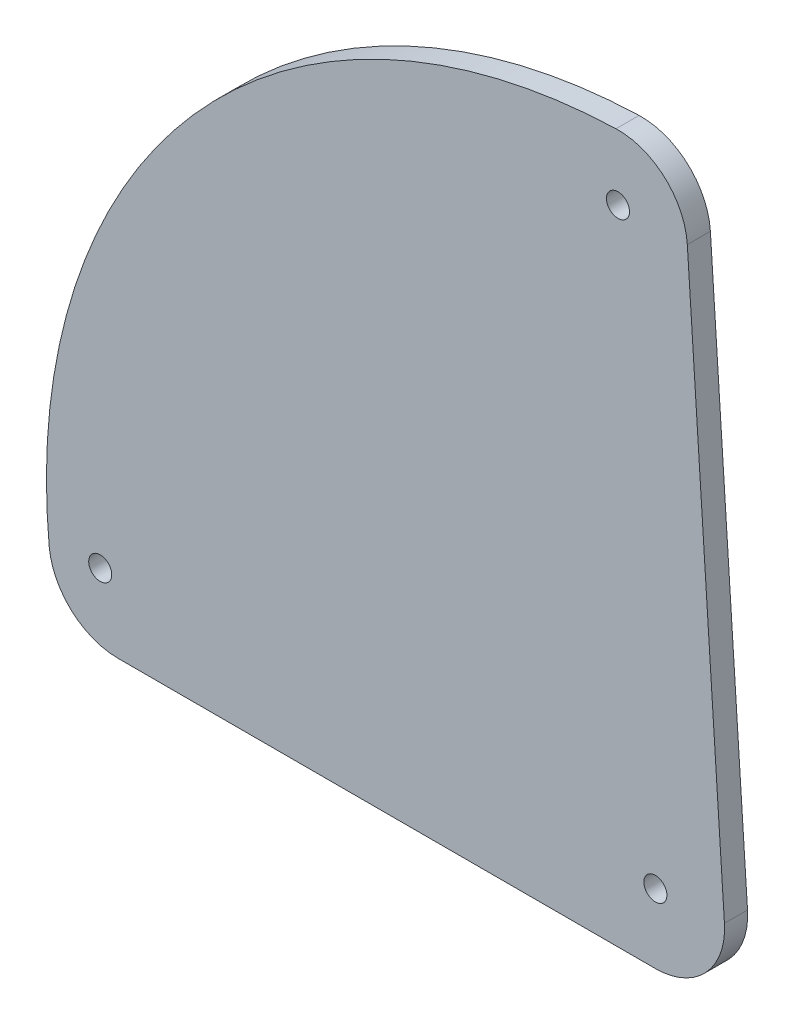
ISO-10303-21;
HEADER;
FILE_DESCRIPTION(('STEP AP214'),'2;1');
FILE_NAME('part.step','',(''),(''),'','','');
FILE_SCHEMA(('AUTOMOTIVE_DESIGN { 1 0 10303 214 1 1 1 1 }'));
ENDSEC;
DATA;
#1=APPLICATION_CONTEXT('core data for automotive mechanical design processes');
#2=APPLICATION_PROTOCOL_DEFINITION('international standard','automotive_design',2000,#1);
#3=PRODUCT_CONTEXT('',#1,'mechanical');
#4=PRODUCT('Part','Part','',(#3));
#5=PRODUCT_RELATED_PRODUCT_CATEGORY('part','',(#4));
#6=PRODUCT_DEFINITION_FORMATION('','',#4);
#7=PRODUCT_DEFINITION_CONTEXT('part definition',#1,'design');
#8=PRODUCT_DEFINITION('design','',#6,#7);
#9=PRODUCT_DEFINITION_SHAPE('','',#8);
#10=(LENGTH_UNIT() NAMED_UNIT(*) SI_UNIT(.MILLI.,.METRE.));
#11=(NAMED_UNIT(*) PLANE_ANGLE_UNIT() SI_UNIT($,.RADIAN.));
#12=(NAMED_UNIT(*) SI_UNIT($,.STERADIAN.) SOLID_ANGLE_UNIT());
#13=UNCERTAINTY_MEASURE_WITH_UNIT(LENGTH_MEASURE(1.E-05),#10,'distance_accuracy_value','');
#14=(GEOMETRIC_REPRESENTATION_CONTEXT(3) GLOBAL_UNCERTAINTY_ASSIGNED_CONTEXT((#13)) GLOBAL_UNIT_ASSIGNED_CONTEXT((#10,
#11,#12)) REPRESENTATION_CONTEXT('',''));
#15=CARTESIAN_POINT('',(0.,0.,0.));
#16=DIRECTION('',(0.,0.,1.));
#17=DIRECTION('',(1.,0.,0.));
#18=AXIS2_PLACEMENT_3D('',#15,#16,#17);
#19=CARTESIAN_POINT('',(112.254705657256,68.7333805444998,-23.206005243));
#20=DIRECTION('',(0.,0.,1.));
#21=DIRECTION('',(1.,0.,0.));
#22=AXIS2_PLACEMENT_3D('',#19,#20,#21);
#23=CYLINDRICAL_SURFACE('',#22,14.9999999888805);
#24=CARTESIAN_POINT('',(112.254705657256,68.7333805444998,-18.206005243));
#25=DIRECTION('',(0.,0.,1.));
#26=DIRECTION('',(1.,0.,0.));
#27=AXIS2_PLACEMENT_3D('',#24,#25,#26);
#28=CIRCLE('',#27,14.9999999888805);
#29=CARTESIAN_POINT('',(127.222902207337,69.7096447016691,-18.206005243));
#30=VERTEX_POINT('',#29);
#31=CARTESIAN_POINT('',(111.771655863061,83.7256006123464,-18.206005243));
#32=VERTEX_POINT('',#31);
#33=EDGE_CURVE('E130',#30,#32,#28,.T.);
#34=ORIENTED_EDGE('',*,*,#33,.F.);
#35=DIRECTION('',(0.,0.,1.));
#36=VECTOR('',#35,1.);
#37=CARTESIAN_POINT('',(127.222902207337,69.7096447016691,-23.206005243));
#38=LINE('',#37,#36);
#39=CARTESIAN_POINT('',(127.222902207337,69.7096447016691,-23.206005243));
#40=VERTEX_POINT('',#39);
#41=EDGE_CURVE('E11',#40,#30,#38,.T.);
#42=ORIENTED_EDGE('',*,*,#41,.F.);
#43=CARTESIAN_POINT('',(112.254705657256,68.7333805444998,-23.206005243));
#44=DIRECTION('',(0.,0.,1.));
#45=DIRECTION('',(1.,0.,0.));
#46=AXIS2_PLACEMENT_3D('',#43,#44,#45);
#47=CIRCLE('',#46,14.9999999888805);
#48=CARTESIAN_POINT('',(111.771655863061,83.7256006123464,-23.206005243));
#49=VERTEX_POINT('',#48);
#50=EDGE_CURVE('E151',#40,#49,#47,.T.);
#51=ORIENTED_EDGE('',*,*,#50,.T.);
#52=DIRECTION('',(0.,0.,1.));
#53=VECTOR('',#52,1.);
#54=CARTESIAN_POINT('',(111.771655863061,83.7256006123464,-23.206005243));
#55=LINE('',#54,#53);
#56=EDGE_CURVE('E42',#49,#32,#55,.T.);
#57=ORIENTED_EDGE('',*,*,#56,.T.);
#58=EDGE_LOOP('',(#34,#42,#51,#57));
#59=FACE_BOUND('',#58,.T.);
#60=ADVANCED_FACE('F39',(#59),#23,.T.);
#61=CARTESIAN_POINT('',(135.268196543963,-53.6417515874666,-23.206005243));
#62=DIRECTION('',(0.997879770745094,0.065084277192868,0.));
#63=DIRECTION('',(-0.065084277192868,0.997879770745094,0.));
#64=AXIS2_PLACEMENT_3D('',#61,#62,#63);
#65=PLANE('',#64);
#66=DIRECTION('',(-0.065084277192868,0.997879770745094,0.));
#67=VECTOR('',#66,1.);
#68=CARTESIAN_POINT('',(135.268196543963,-53.6417515874666,-18.206005243));
#69=LINE('',#68,#67);
#70=CARTESIAN_POINT('',(135.268196543963,-53.6417515874666,-18.206005243));
#71=VERTEX_POINT('',#70);
#72=EDGE_CURVE('E148',#71,#30,#69,.T.);
#73=ORIENTED_EDGE('',*,*,#72,.F.);
#74=DIRECTION('',(0.,0.,1.));
#75=VECTOR('',#74,1.);
#76=CARTESIAN_POINT('',(135.268196543963,-53.6417515874666,-23.206005243));
#77=LINE('',#76,#75);
#78=CARTESIAN_POINT('',(135.268196543963,-53.6417515874666,-23.206005243));
#79=VERTEX_POINT('',#78);
#80=EDGE_CURVE('E49',#79,#71,#77,.T.);
#81=ORIENTED_EDGE('',*,*,#80,.F.);
#82=DIRECTION('',(-0.065084277192868,0.997879770745094,0.));
#83=VECTOR('',#82,1.);
#84=CARTESIAN_POINT('',(135.268196543963,-53.6417515874666,-23.206005243));
#85=LINE('',#84,#83);
#86=EDGE_CURVE('E116',#79,#40,#85,.T.);
#87=ORIENTED_EDGE('',*,*,#86,.T.);
#88=ORIENTED_EDGE('',*,*,#41,.T.);
#89=EDGE_LOOP('',(#73,#81,#87,#88));
#90=FACE_BOUND('',#89,.T.);
#91=ADVANCED_FACE('F163',(#90),#65,.T.);
#92=CARTESIAN_POINT('',(120.299999998114,-54.61801574436,-23.206005243));
#93=DIRECTION('',(0.,0.,1.));
#94=DIRECTION('',(1.,0.,0.));
#95=AXIS2_PLACEMENT_3D('',#92,#93,#94);
#96=CYLINDRICAL_SURFACE('',#95,14.99999998464);
#97=CARTESIAN_POINT('',(120.299999998114,-54.61801574436,-18.206005243));
#98=DIRECTION('',(0.,0.,1.));
#99=DIRECTION('',(1.,0.,0.));
#100=AXIS2_PLACEMENT_3D('',#97,#98,#99);
#101=CIRCLE('',#100,14.99999998464);
#102=CARTESIAN_POINT('',(120.299999998114,-69.618015729,-18.206005243));
#103=VERTEX_POINT('',#102);
#104=EDGE_CURVE('E102',#103,#71,#101,.T.);
#105=ORIENTED_EDGE('',*,*,#104,.F.);
#106=DIRECTION('',(0.,0.,1.));
#107=VECTOR('',#106,1.);
#108=CARTESIAN_POINT('',(120.299999998114,-69.618015729,-23.206005243));
#109=LINE('',#108,#107);
#110=CARTESIAN_POINT('',(120.299999998114,-69.618015729,-23.206005243));
#111=VERTEX_POINT('',#110);
#112=EDGE_CURVE('E97',#111,#103,#109,.T.);
#113=ORIENTED_EDGE('',*,*,#112,.F.);
#114=CARTESIAN_POINT('',(120.299999998114,-54.61801574436,-23.206005243));
#115=DIRECTION('',(0.,0.,1.));
#116=DIRECTION('',(1.,0.,0.));
#117=AXIS2_PLACEMENT_3D('',#114,#115,#116);
#118=CIRCLE('',#117,14.99999998464);
#119=EDGE_CURVE('E100',#111,#79,#118,.T.);
#120=ORIENTED_EDGE('',*,*,#119,.T.);
#121=ORIENTED_EDGE('',*,*,#80,.T.);
#122=EDGE_LOOP('',(#105,#113,#120,#121));
#123=FACE_BOUND('',#122,.T.);
#124=ADVANCED_FACE('F99',(#123),#96,.T.);
#125=CARTESIAN_POINT('',(3.867902109,-69.618015729,-23.206005243));
#126=DIRECTION('',(0.,-1.,0.));
#127=DIRECTION('',(1.,0.,0.));
#128=AXIS2_PLACEMENT_3D('',#125,#126,#127);
#129=PLANE('',#128);
#130=DIRECTION('',(1.,0.,0.));
#131=VECTOR('',#130,1.);
#132=CARTESIAN_POINT('',(3.867902109,-69.618015729,-18.206005243));
#133=LINE('',#132,#131);
#134=CARTESIAN_POINT('',(3.867902109,-69.618015729,-18.206005243));
#135=VERTEX_POINT('',#134);
#136=EDGE_CURVE('E143',#135,#103,#133,.T.);
#137=ORIENTED_EDGE('',*,*,#136,.F.);
#138=DIRECTION('',(0.,0.,1.));
#139=VECTOR('',#138,1.);
#140=CARTESIAN_POINT('',(3.867902109,-69.618015729,-23.206005243));
#141=LINE('',#140,#139);
#142=CARTESIAN_POINT('',(3.867902109,-69.618015729,-23.206005243));
#143=VERTEX_POINT('',#142);
#144=EDGE_CURVE('E108',#143,#135,#141,.T.);
#145=ORIENTED_EDGE('',*,*,#144,.F.);
#146=DIRECTION('',(1.,0.,0.));
#147=VECTOR('',#146,1.);
#148=CARTESIAN_POINT('',(3.867902109,-69.618015729,-23.206005243));
#149=LINE('',#148,#147);
#150=EDGE_CURVE('E114',#143,#111,#149,.T.);
#151=ORIENTED_EDGE('',*,*,#150,.T.);
#152=ORIENTED_EDGE('',*,*,#112,.T.);
#153=EDGE_LOOP('',(#137,#145,#151,#152));
#154=FACE_BOUND('',#153,.T.);
#155=ADVANCED_FACE('F119',(#154),#129,.T.);
#156=CARTESIAN_POINT('',(3.867902109,-54.6180157281932,-23.206005243));
#157=DIRECTION('',(0.,0.,1.));
#158=DIRECTION('',(1.,0.,0.));
#159=AXIS2_PLACEMENT_3D('',#156,#157,#158);
#160=CYLINDRICAL_SURFACE('',#159,15.0000000008068);
#161=CARTESIAN_POINT('',(3.867902109,-54.6180157281932,-18.206005243));
#162=DIRECTION('',(0.,0.,1.));
#163=DIRECTION('',(1.,0.,0.));
#164=AXIS2_PLACEMENT_3D('',#161,#162,#163);
#165=CIRCLE('',#164,15.0000000008068);
#166=CARTESIAN_POINT('',(-11.0619297396069,-56.0671951499786,-18.206005243));
#167=VERTEX_POINT('',#166);
#168=EDGE_CURVE('E139',#167,#135,#165,.T.);
#169=ORIENTED_EDGE('',*,*,#168,.F.);
#170=DIRECTION('',(0.,0.,1.));
#171=VECTOR('',#170,1.);
#172=CARTESIAN_POINT('',(-11.0619297396069,-56.0671951499786,-23.206005243));
#173=LINE('',#172,#171);
#174=CARTESIAN_POINT('',(-11.0619297396069,-56.0671951499786,-23.206005243));
#175=VERTEX_POINT('',#174);
#176=EDGE_CURVE('E156',#175,#167,#173,.T.);
#177=ORIENTED_EDGE('',*,*,#176,.F.);
#178=CARTESIAN_POINT('',(3.867902109,-54.6180157281932,-23.206005243));
#179=DIRECTION('',(0.,0.,1.));
#180=DIRECTION('',(1.,0.,0.));
#181=AXIS2_PLACEMENT_3D('',#178,#179,#180);
#182=CIRCLE('',#181,15.0000000008068);
#183=EDGE_CURVE('E121',#175,#143,#182,.T.);
#184=ORIENTED_EDGE('',*,*,#183,.T.);
#185=ORIENTED_EDGE('',*,*,#144,.T.);
#186=EDGE_LOOP('',(#169,#177,#184,#185));
#187=FACE_BOUND('',#186,.T.);
#188=ADVANCED_FACE('F176',(#187),#160,.T.);
#189=CARTESIAN_POINT('',(115.878780762631,-43.745565053132,-23.206005243));
#190=DIRECTION('',(0.,0.,1.));
#191=DIRECTION('',(1.,0.,0.));
#192=AXIS2_PLACEMENT_3D('',#189,#190,#191);
#193=CYLINDRICAL_SURFACE('',#192,127.537314347827);
#194=CARTESIAN_POINT('',(115.878780762631,-43.745565053132,-18.206005243));
#195=DIRECTION('',(0.,0.,1.));
#196=DIRECTION('',(1.,0.,0.));
#197=AXIS2_PLACEMENT_3D('',#194,#195,#196);
#198=CIRCLE('',#197,127.537314347827);
#199=EDGE_CURVE('E134',#32,#167,#198,.T.);
#200=ORIENTED_EDGE('',*,*,#199,.F.);
#201=ORIENTED_EDGE('',*,*,#56,.F.);
#202=CARTESIAN_POINT('',(115.878780762631,-43.745565053132,-23.206005243));
#203=DIRECTION('',(0.,0.,1.));
#204=DIRECTION('',(1.,0.,0.));
#205=AXIS2_PLACEMENT_3D('',#202,#203,#204);
#206=CIRCLE('',#205,127.537314347827);
#207=EDGE_CURVE('E124',#49,#175,#206,.T.);
#208=ORIENTED_EDGE('',*,*,#207,.T.);
#209=ORIENTED_EDGE('',*,*,#176,.T.);
#210=EDGE_LOOP('',(#200,#201,#208,#209));
#211=FACE_BOUND('',#210,.T.);
#212=ADVANCED_FACE('F160',(#211),#193,.T.);
#213=CARTESIAN_POINT('',(112.254705657256,68.7333805444998,-23.206005243));
#214=DIRECTION('',(0.,0.,1.));
#215=DIRECTION('',(1.,0.,0.));
#216=AXIS2_PLACEMENT_3D('',#213,#214,#215);
#217=PLANE('',#216);
#218=CARTESIAN_POINT('',(0.,-54.618015729,-23.206005243));
#219=DIRECTION('',(0.,0.,1.));
#220=DIRECTION('',(-1.,0.,0.));
#221=AXIS2_PLACEMENT_3D('',#218,#219,#220);
#222=CIRCLE('',#221,2.5);
#223=CARTESIAN_POINT('',(-2.5,-54.618015729,-23.206005243));
#224=VERTEX_POINT('',#223);
#225=EDGE_CURVE('E206',#224,#224,#222,.T.);
#226=ORIENTED_EDGE('',*,*,#225,.T.);
#227=EDGE_LOOP('',(#226));
#228=FACE_BOUND('',#227,.T.);
#229=CARTESIAN_POINT('',(112.197007482,69.618015729,-23.206005243));
#230=DIRECTION('',(0.,0.,1.));
#231=DIRECTION('',(-1.,0.,0.));
#232=AXIS2_PLACEMENT_3D('',#229,#230,#231);
#233=CIRCLE('',#232,2.5);
#234=CARTESIAN_POINT('',(109.697007482,69.618015729,-23.206005243));
#235=VERTEX_POINT('',#234);
#236=EDGE_CURVE('E216',#235,#235,#233,.T.);
#237=ORIENTED_EDGE('',*,*,#236,.T.);
#238=EDGE_LOOP('',(#237));
#239=FACE_BOUND('',#238,.T.);
#240=CARTESIAN_POINT('',(120.299999998114,-54.61801574436,-23.206005243));
#241=DIRECTION('',(0.,0.,1.));
#242=DIRECTION('',(-1.,0.,0.));
#243=AXIS2_PLACEMENT_3D('',#240,#241,#242);
#244=CIRCLE('',#243,2.5);
#245=CARTESIAN_POINT('',(117.799999998114,-54.61801574436,-23.206005243));
#246=VERTEX_POINT('',#245);
#247=EDGE_CURVE('E135',#246,#246,#244,.T.);
#248=ORIENTED_EDGE('',*,*,#247,.T.);
#249=EDGE_LOOP('',(#248));
#250=FACE_BOUND('',#249,.T.);
#251=ORIENTED_EDGE('',*,*,#50,.F.);
#252=ORIENTED_EDGE('',*,*,#86,.F.);
#253=ORIENTED_EDGE('',*,*,#119,.F.);
#254=ORIENTED_EDGE('',*,*,#150,.F.);
#255=ORIENTED_EDGE('',*,*,#183,.F.);
#256=ORIENTED_EDGE('',*,*,#207,.F.);
#257=EDGE_LOOP('',(#251,#252,#253,#254,#255,#256));
#258=FACE_BOUND('',#257,.T.);
#259=ADVANCED_FACE('F112',(#228,#239,#250,#258),#217,.F.);
#260=CARTESIAN_POINT('',(112.254705657256,68.7333805444998,-18.206005243));
#261=DIRECTION('',(0.,0.,1.));
#262=DIRECTION('',(1.,0.,0.));
#263=AXIS2_PLACEMENT_3D('',#260,#261,#262);
#264=PLANE('',#263);
#265=CARTESIAN_POINT('',(0.,-54.618015729,-18.206005243));
#266=DIRECTION('',(0.,0.,1.));
#267=DIRECTION('',(-1.,0.,0.));
#268=AXIS2_PLACEMENT_3D('',#265,#266,#267);
#269=CIRCLE('',#268,2.5);
#270=CARTESIAN_POINT('',(-2.5,-54.618015729,-18.206005243));
#271=VERTEX_POINT('',#270);
#272=EDGE_CURVE('E209',#271,#271,#269,.T.);
#273=ORIENTED_EDGE('',*,*,#272,.F.);
#274=EDGE_LOOP('',(#273));
#275=FACE_BOUND('',#274,.T.);
#276=CARTESIAN_POINT('',(112.197007482,69.618015729,-18.206005243));
#277=DIRECTION('',(0.,0.,1.));
#278=DIRECTION('',(-1.,0.,0.));
#279=AXIS2_PLACEMENT_3D('',#276,#277,#278);
#280=CIRCLE('',#279,2.5);
#281=CARTESIAN_POINT('',(109.697007482,69.618015729,-18.206005243));
#282=VERTEX_POINT('',#281);
#283=EDGE_CURVE('E213',#282,#282,#280,.T.);
#284=ORIENTED_EDGE('',*,*,#283,.F.);
#285=EDGE_LOOP('',(#284));
#286=FACE_BOUND('',#285,.T.);
#287=CARTESIAN_POINT('',(120.299999998114,-54.61801574436,-18.206005243));
#288=DIRECTION('',(0.,0.,1.));
#289=DIRECTION('',(-1.,0.,0.));
#290=AXIS2_PLACEMENT_3D('',#287,#288,#289);
#291=CIRCLE('',#290,2.5);
#292=CARTESIAN_POINT('',(117.799999998114,-54.61801574436,-18.206005243));
#293=VERTEX_POINT('',#292);
#294=EDGE_CURVE('E220',#293,#293,#291,.T.);
#295=ORIENTED_EDGE('',*,*,#294,.F.);
#296=EDGE_LOOP('',(#295));
#297=FACE_BOUND('',#296,.T.);
#298=ORIENTED_EDGE('',*,*,#33,.T.);
#299=ORIENTED_EDGE('',*,*,#199,.T.);
#300=ORIENTED_EDGE('',*,*,#168,.T.);
#301=ORIENTED_EDGE('',*,*,#136,.T.);
#302=ORIENTED_EDGE('',*,*,#104,.T.);
#303=ORIENTED_EDGE('',*,*,#72,.T.);
#304=EDGE_LOOP('',(#298,#299,#300,#301,#302,#303));
#305=FACE_BOUND('',#304,.T.);
#306=ADVANCED_FACE('F162',(#275,#286,#297,#305),#264,.T.);
#307=CARTESIAN_POINT('',(120.299999998114,-54.61801574436,-23.206005243));
#308=DIRECTION('',(0.,0.,1.));
#309=DIRECTION('',(1.,0.,0.));
#310=AXIS2_PLACEMENT_3D('',#307,#308,#309);
#311=CYLINDRICAL_SURFACE('',#310,2.5);
#312=ORIENTED_EDGE('',*,*,#247,.F.);
#313=EDGE_LOOP('',(#312));
#314=FACE_BOUND('',#313,.T.);
#315=ORIENTED_EDGE('',*,*,#294,.T.);
#316=EDGE_LOOP('',(#315));
#317=FACE_BOUND('',#316,.T.);
#318=ADVANCED_FACE('F187',(#314,#317),#311,.F.);
#319=CARTESIAN_POINT('',(112.197007482,69.618015729,-23.206005243));
#320=DIRECTION('',(0.,0.,1.));
#321=DIRECTION('',(1.,0.,0.));
#322=AXIS2_PLACEMENT_3D('',#319,#320,#321);
#323=CYLINDRICAL_SURFACE('',#322,2.5);
#324=ORIENTED_EDGE('',*,*,#236,.F.);
#325=EDGE_LOOP('',(#324));
#326=FACE_BOUND('',#325,.T.);
#327=ORIENTED_EDGE('',*,*,#283,.T.);
#328=EDGE_LOOP('',(#327));
#329=FACE_BOUND('',#328,.T.);
#330=ADVANCED_FACE('F194',(#326,#329),#323,.F.);
#331=CARTESIAN_POINT('',(0.,-54.618015729,-23.206005243));
#332=DIRECTION('',(0.,0.,1.));
#333=DIRECTION('',(1.,0.,0.));
#334=AXIS2_PLACEMENT_3D('',#331,#332,#333);
#335=CYLINDRICAL_SURFACE('',#334,2.5);
#336=ORIENTED_EDGE('',*,*,#225,.F.);
#337=EDGE_LOOP('',(#336));
#338=FACE_BOUND('',#337,.T.);
#339=ORIENTED_EDGE('',*,*,#272,.T.);
#340=EDGE_LOOP('',(#339));
#341=FACE_BOUND('',#340,.T.);
#342=ADVANCED_FACE('F198',(#338,#341),#335,.F.);
#343=CLOSED_SHELL('',(#60,#91,#124,#155,#188,#212,#259,#306,#318,#330,#342));
#344=MANIFOLD_SOLID_BREP('B2',#343);
#345=ADVANCED_BREP_SHAPE_REPRESENTATION('',(#18,#344),#14);
#346=SHAPE_DEFINITION_REPRESENTATION(#9,#345);
ENDSEC;
END-ISO-10303-21;
